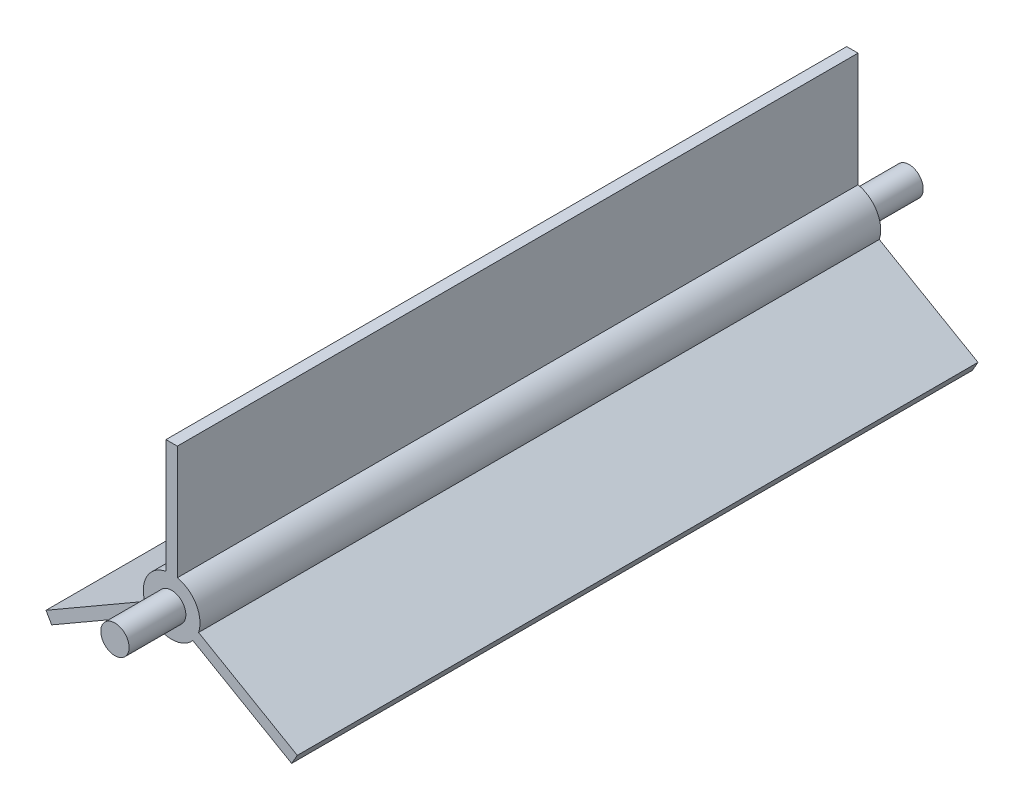
ISO-10303-21;
HEADER;
FILE_DESCRIPTION(('STEP AP214'),'2;1');
FILE_NAME('part.step','',(''),(''),'','','');
FILE_SCHEMA(('AUTOMOTIVE_DESIGN { 1 0 10303 214 1 1 1 1 }'));
ENDSEC;
DATA;
#1=APPLICATION_CONTEXT('core data for automotive mechanical design processes');
#2=APPLICATION_PROTOCOL_DEFINITION('international standard','automotive_design',2000,#1);
#3=PRODUCT_CONTEXT('',#1,'mechanical');
#4=PRODUCT('Part','Part','',(#3));
#5=PRODUCT_RELATED_PRODUCT_CATEGORY('part','',(#4));
#6=PRODUCT_DEFINITION_FORMATION('','',#4);
#7=PRODUCT_DEFINITION_CONTEXT('part definition',#1,'design');
#8=PRODUCT_DEFINITION('design','',#6,#7);
#9=PRODUCT_DEFINITION_SHAPE('','',#8);
#10=(LENGTH_UNIT() NAMED_UNIT(*) SI_UNIT(.MILLI.,.METRE.));
#11=(NAMED_UNIT(*) PLANE_ANGLE_UNIT() SI_UNIT($,.RADIAN.));
#12=(NAMED_UNIT(*) SI_UNIT($,.STERADIAN.) SOLID_ANGLE_UNIT());
#13=UNCERTAINTY_MEASURE_WITH_UNIT(LENGTH_MEASURE(1.E-05),#10,'distance_accuracy_value','');
#14=(GEOMETRIC_REPRESENTATION_CONTEXT(3) GLOBAL_UNCERTAINTY_ASSIGNED_CONTEXT((#13)) GLOBAL_UNIT_ASSIGNED_CONTEXT((#10,
#11,#12)) REPRESENTATION_CONTEXT('',''));
#15=CARTESIAN_POINT('',(0.,0.,0.));
#16=DIRECTION('',(0.,0.,1.));
#17=DIRECTION('',(1.,0.,0.));
#18=AXIS2_PLACEMENT_3D('',#15,#16,#17);
#19=CARTESIAN_POINT('',(-1.27000000000001,2.19970452561247,304.8));
#20=DIRECTION('',(0.500000000000004,-0.866025403784436,0.));
#21=DIRECTION('',(0.866025403784436,0.500000000000004,0.));
#22=AXIS2_PLACEMENT_3D('',#19,#20,#21);
#23=PLANE('',#22);
#24=DIRECTION('',(-0.866025403784436,-0.500000000000004,0.));
#25=VECTOR('',#24,1.);
#26=CARTESIAN_POINT('',(-1.27000000000001,2.19970452561247,0.));
#27=LINE('',#26,#25);
#28=CARTESIAN_POINT('',(-12.046307345283,-4.02199942105686,0.));
#29=VERTEX_POINT('',#28);
#30=CARTESIAN_POINT('',(-56.2626131403117,-29.5502954743878,0.));
#31=VERTEX_POINT('',#30);
#32=EDGE_CURVE('E167',#29,#31,#27,.T.);
#33=ORIENTED_EDGE('',*,*,#32,.T.);
#34=DIRECTION('',(0.,0.,-1.));
#35=VECTOR('',#34,1.);
#36=CARTESIAN_POINT('',(-56.2626131403117,-29.5502954743878,304.8));
#37=LINE('',#36,#35);
#38=CARTESIAN_POINT('',(-56.2626131403117,-29.5502954743878,304.8));
#39=VERTEX_POINT('',#38);
#40=EDGE_CURVE('E51',#39,#31,#37,.T.);
#41=ORIENTED_EDGE('',*,*,#40,.F.);
#42=DIRECTION('',(-0.866025403784436,-0.500000000000004,0.));
#43=VECTOR('',#42,1.);
#44=CARTESIAN_POINT('',(-1.27000000000001,2.19970452561247,304.8));
#45=LINE('',#44,#43);
#46=CARTESIAN_POINT('',(-12.046307345283,-4.02199942105686,304.8));
#47=VERTEX_POINT('',#46);
#48=EDGE_CURVE('E208',#47,#39,#45,.T.);
#49=ORIENTED_EDGE('',*,*,#48,.F.);
#50=DIRECTION('',(0.,0.,-1.));
#51=VECTOR('',#50,1.);
#52=CARTESIAN_POINT('',(-12.046307345283,-4.02199942105686,304.8));
#53=LINE('',#52,#51);
#54=EDGE_CURVE('E163',#47,#29,#53,.T.);
#55=ORIENTED_EDGE('',*,*,#54,.T.);
#56=EDGE_LOOP('',(#33,#41,#49,#55));
#57=FACE_BOUND('',#56,.T.);
#58=ADVANCED_FACE('F41',(#57),#23,.F.);
#59=CARTESIAN_POINT('',(-54.9926131403117,-31.7500000000003,304.8));
#60=DIRECTION('',(0.866025403784436,0.500000000000005,0.));
#61=DIRECTION('',(-0.500000000000005,0.866025403784436,0.));
#62=AXIS2_PLACEMENT_3D('',#59,#60,#61);
#63=PLANE('',#62);
#64=DIRECTION('',(0.500000000000005,-0.866025403784436,0.));
#65=VECTOR('',#64,1.);
#66=CARTESIAN_POINT('',(-54.9926131403117,-31.7500000000003,0.));
#67=LINE('',#66,#65);
#68=CARTESIAN_POINT('',(-53.7226131403117,-33.9497045256128,0.));
#69=VERTEX_POINT('',#68);
#70=EDGE_CURVE('E171',#31,#69,#67,.T.);
#71=ORIENTED_EDGE('',*,*,#70,.T.);
#72=DIRECTION('',(0.,0.,-1.));
#73=VECTOR('',#72,1.);
#74=CARTESIAN_POINT('',(-53.7226131403117,-33.9497045256128,304.8));
#75=LINE('',#74,#73);
#76=CARTESIAN_POINT('',(-53.7226131403117,-33.9497045256128,304.8));
#77=VERTEX_POINT('',#76);
#78=EDGE_CURVE('E235',#77,#69,#75,.T.);
#79=ORIENTED_EDGE('',*,*,#78,.F.);
#80=DIRECTION('',(0.500000000000005,-0.866025403784436,0.));
#81=VECTOR('',#80,1.);
#82=CARTESIAN_POINT('',(-54.9926131403117,-31.7500000000003,304.8));
#83=LINE('',#82,#81);
#84=EDGE_CURVE('E112',#39,#77,#83,.T.);
#85=ORIENTED_EDGE('',*,*,#84,.F.);
#86=ORIENTED_EDGE('',*,*,#40,.T.);
#87=EDGE_LOOP('',(#71,#79,#85,#86));
#88=FACE_BOUND('',#87,.T.);
#89=ADVANCED_FACE('F239',(#88),#63,.F.);
#90=CARTESIAN_POINT('',(1.27000000000001,-2.19970452561247,304.8));
#91=DIRECTION('',(0.500000000000004,-0.866025403784436,0.));
#92=DIRECTION('',(0.866025403784436,0.500000000000005,0.));
#93=AXIS2_PLACEMENT_3D('',#90,#91,#92);
#94=PLANE('',#93);
#95=DIRECTION('',(-0.866025403784436,-0.500000000000004,0.));
#96=VECTOR('',#95,1.);
#97=CARTESIAN_POINT('',(1.27000000000001,-2.19970452561247,0.));
#98=LINE('',#97,#96);
#99=CARTESIAN_POINT('',(-9.50630734528294,-8.4214084722818,0.));
#100=VERTEX_POINT('',#99);
#101=EDGE_CURVE('E175',#100,#69,#98,.T.);
#102=ORIENTED_EDGE('',*,*,#101,.F.);
#103=DIRECTION('',(0.,0.,-1.));
#104=VECTOR('',#103,1.);
#105=CARTESIAN_POINT('',(-9.50630734528294,-8.4214084722818,304.8));
#106=LINE('',#105,#104);
#107=CARTESIAN_POINT('',(-9.50630734528294,-8.4214084722818,304.8));
#108=VERTEX_POINT('',#107);
#109=EDGE_CURVE('E232',#108,#100,#106,.T.);
#110=ORIENTED_EDGE('',*,*,#109,.F.);
#111=DIRECTION('',(-0.866025403784436,-0.500000000000004,0.));
#112=VECTOR('',#111,1.);
#113=CARTESIAN_POINT('',(1.27000000000001,-2.19970452561247,304.8));
#114=LINE('',#113,#112);
#115=EDGE_CURVE('E253',#108,#77,#114,.T.);
#116=ORIENTED_EDGE('',*,*,#115,.T.);
#117=ORIENTED_EDGE('',*,*,#78,.T.);
#118=EDGE_LOOP('',(#102,#110,#116,#117));
#119=FACE_BOUND('',#118,.T.);
#120=ADVANCED_FACE('F249',(#119),#94,.T.);
#121=CARTESIAN_POINT('',(0.,0.,304.8));
#122=DIRECTION('',(0.,0.,-1.));
#123=DIRECTION('',(-1.,0.,0.));
#124=AXIS2_PLACEMENT_3D('',#121,#122,#123);
#125=CYLINDRICAL_SURFACE('',#124,12.7);
#126=CARTESIAN_POINT('',(0.,0.,0.));
#127=DIRECTION('',(0.,0.,1.));
#128=DIRECTION('',(1.,0.,0.));
#129=AXIS2_PLACEMENT_3D('',#126,#127,#128);
#130=CIRCLE('',#129,12.7);
#131=CARTESIAN_POINT('',(9.50630734528294,-8.42140847228179,0.));
#132=VERTEX_POINT('',#131);
#133=EDGE_CURVE('E179',#100,#132,#130,.T.);
#134=ORIENTED_EDGE('',*,*,#133,.T.);
#135=DIRECTION('',(0.,0.,-1.));
#136=VECTOR('',#135,1.);
#137=CARTESIAN_POINT('',(9.50630734528294,-8.42140847228179,304.8));
#138=LINE('',#137,#136);
#139=CARTESIAN_POINT('',(9.50630734528294,-8.42140847228179,304.8));
#140=VERTEX_POINT('',#139);
#141=EDGE_CURVE('E228',#140,#132,#138,.T.);
#142=ORIENTED_EDGE('',*,*,#141,.F.);
#143=CARTESIAN_POINT('',(0.,0.,304.8));
#144=DIRECTION('',(0.,0.,1.));
#145=DIRECTION('',(1.,0.,0.));
#146=AXIS2_PLACEMENT_3D('',#143,#144,#145);
#147=CIRCLE('',#146,12.7);
#148=EDGE_CURVE('E255',#108,#140,#147,.T.);
#149=ORIENTED_EDGE('',*,*,#148,.F.);
#150=ORIENTED_EDGE('',*,*,#109,.T.);
#151=EDGE_LOOP('',(#134,#142,#149,#150));
#152=FACE_BOUND('',#151,.T.);
#153=ADVANCED_FACE('F299',(#152),#125,.T.);
#154=CARTESIAN_POINT('',(-1.27000000000001,-2.19970452561247,304.8));
#155=DIRECTION('',(0.500000000000004,0.866025403784436,0.));
#156=DIRECTION('',(-0.866025403784436,0.500000000000004,0.));
#157=AXIS2_PLACEMENT_3D('',#154,#155,#156);
#158=PLANE('',#157);
#159=DIRECTION('',(0.866025403784436,-0.500000000000004,0.));
#160=VECTOR('',#159,1.);
#161=CARTESIAN_POINT('',(-1.27000000000001,-2.19970452561247,0.));
#162=LINE('',#161,#160);
#163=CARTESIAN_POINT('',(53.7226131403117,-33.9497045256127,0.));
#164=VERTEX_POINT('',#163);
#165=EDGE_CURVE('E182',#132,#164,#162,.T.);
#166=ORIENTED_EDGE('',*,*,#165,.T.);
#167=DIRECTION('',(0.,0.,-1.));
#168=VECTOR('',#167,1.);
#169=CARTESIAN_POINT('',(53.7226131403117,-33.9497045256127,304.8));
#170=LINE('',#169,#168);
#171=CARTESIAN_POINT('',(53.7226131403117,-33.9497045256127,304.8));
#172=VERTEX_POINT('',#171);
#173=EDGE_CURVE('E225',#172,#164,#170,.T.);
#174=ORIENTED_EDGE('',*,*,#173,.F.);
#175=DIRECTION('',(0.866025403784436,-0.500000000000004,0.));
#176=VECTOR('',#175,1.);
#177=CARTESIAN_POINT('',(-1.27000000000001,-2.19970452561247,304.8));
#178=LINE('',#177,#176);
#179=EDGE_CURVE('E259',#140,#172,#178,.T.);
#180=ORIENTED_EDGE('',*,*,#179,.F.);
#181=ORIENTED_EDGE('',*,*,#141,.T.);
#182=EDGE_LOOP('',(#166,#174,#180,#181));
#183=FACE_BOUND('',#182,.T.);
#184=ADVANCED_FACE('F295',(#183),#158,.F.);
#185=CARTESIAN_POINT('',(54.9926131403118,-31.7500000000002,304.8));
#186=DIRECTION('',(0.866025403784437,-0.500000000000003,0.));
#187=DIRECTION('',(0.500000000000003,0.866025403784437,0.));
#188=AXIS2_PLACEMENT_3D('',#185,#186,#187);
#189=PLANE('',#188);
#190=DIRECTION('',(-0.500000000000003,-0.866025403784437,0.));
#191=VECTOR('',#190,1.);
#192=CARTESIAN_POINT('',(54.9926131403118,-31.7500000000002,0.));
#193=LINE('',#192,#191);
#194=CARTESIAN_POINT('',(56.2626131403117,-29.5502954743878,0.));
#195=VERTEX_POINT('',#194);
#196=EDGE_CURVE('E186',#195,#164,#193,.T.);
#197=ORIENTED_EDGE('',*,*,#196,.F.);
#198=DIRECTION('',(0.,0.,-1.));
#199=VECTOR('',#198,1.);
#200=CARTESIAN_POINT('',(56.2626131403117,-29.5502954743878,304.8));
#201=LINE('',#200,#199);
#202=CARTESIAN_POINT('',(56.2626131403117,-29.5502954743878,304.8));
#203=VERTEX_POINT('',#202);
#204=EDGE_CURVE('E222',#203,#195,#201,.T.);
#205=ORIENTED_EDGE('',*,*,#204,.F.);
#206=DIRECTION('',(-0.500000000000003,-0.866025403784437,0.));
#207=VECTOR('',#206,1.);
#208=CARTESIAN_POINT('',(54.9926131403118,-31.7500000000002,304.8));
#209=LINE('',#208,#207);
#210=EDGE_CURVE('E266',#203,#172,#209,.T.);
#211=ORIENTED_EDGE('',*,*,#210,.T.);
#212=ORIENTED_EDGE('',*,*,#173,.T.);
#213=EDGE_LOOP('',(#197,#205,#211,#212));
#214=FACE_BOUND('',#213,.T.);
#215=ADVANCED_FACE('F292',(#214),#189,.T.);
#216=CARTESIAN_POINT('',(1.27000000000001,2.19970452561247,304.8));
#217=DIRECTION('',(0.500000000000004,0.866025403784436,0.));
#218=DIRECTION('',(-0.866025403784436,0.500000000000004,0.));
#219=AXIS2_PLACEMENT_3D('',#216,#217,#218);
#220=PLANE('',#219);
#221=DIRECTION('',(0.866025403784436,-0.500000000000004,0.));
#222=VECTOR('',#221,1.);
#223=CARTESIAN_POINT('',(1.27000000000001,2.19970452561247,0.));
#224=LINE('',#223,#222);
#225=CARTESIAN_POINT('',(12.046307345283,-4.02199942105685,0.));
#226=VERTEX_POINT('',#225);
#227=EDGE_CURVE('E190',#226,#195,#224,.T.);
#228=ORIENTED_EDGE('',*,*,#227,.F.);
#229=DIRECTION('',(0.,0.,-1.));
#230=VECTOR('',#229,1.);
#231=CARTESIAN_POINT('',(12.046307345283,-4.02199942105685,304.8));
#232=LINE('',#231,#230);
#233=CARTESIAN_POINT('',(12.046307345283,-4.02199942105685,304.8));
#234=VERTEX_POINT('',#233);
#235=EDGE_CURVE('E219',#234,#226,#232,.T.);
#236=ORIENTED_EDGE('',*,*,#235,.F.);
#237=DIRECTION('',(0.866025403784436,-0.500000000000004,0.));
#238=VECTOR('',#237,1.);
#239=CARTESIAN_POINT('',(1.27000000000001,2.19970452561247,304.8));
#240=LINE('',#239,#238);
#241=EDGE_CURVE('E270',#234,#203,#240,.T.);
#242=ORIENTED_EDGE('',*,*,#241,.T.);
#243=ORIENTED_EDGE('',*,*,#204,.T.);
#244=EDGE_LOOP('',(#228,#236,#242,#243));
#245=FACE_BOUND('',#244,.T.);
#246=ADVANCED_FACE('F289',(#245),#220,.T.);
#247=CARTESIAN_POINT('',(0.,0.,304.8));
#248=DIRECTION('',(0.,0.,-1.));
#249=DIRECTION('',(-1.,0.,0.));
#250=AXIS2_PLACEMENT_3D('',#247,#248,#249);
#251=CYLINDRICAL_SURFACE('',#250,12.7);
#252=CARTESIAN_POINT('',(0.,0.,0.));
#253=DIRECTION('',(0.,0.,1.));
#254=DIRECTION('',(1.,0.,0.));
#255=AXIS2_PLACEMENT_3D('',#252,#253,#254);
#256=CIRCLE('',#255,12.7);
#257=CARTESIAN_POINT('',(2.54,12.4434078933385,0.));
#258=VERTEX_POINT('',#257);
#259=EDGE_CURVE('E194',#226,#258,#256,.T.);
#260=ORIENTED_EDGE('',*,*,#259,.T.);
#261=DIRECTION('',(0.,0.,-1.));
#262=VECTOR('',#261,1.);
#263=CARTESIAN_POINT('',(2.54,12.4434078933385,304.8));
#264=LINE('',#263,#262);
#265=CARTESIAN_POINT('',(2.54,12.4434078933385,304.8));
#266=VERTEX_POINT('',#265);
#267=EDGE_CURVE('E215',#266,#258,#264,.T.);
#268=ORIENTED_EDGE('',*,*,#267,.F.);
#269=CARTESIAN_POINT('',(0.,0.,304.8));
#270=DIRECTION('',(0.,0.,1.));
#271=DIRECTION('',(1.,0.,0.));
#272=AXIS2_PLACEMENT_3D('',#269,#270,#271);
#273=CIRCLE('',#272,12.7);
#274=EDGE_CURVE('E274',#234,#266,#273,.T.);
#275=ORIENTED_EDGE('',*,*,#274,.F.);
#276=ORIENTED_EDGE('',*,*,#235,.T.);
#277=EDGE_LOOP('',(#260,#268,#275,#276));
#278=FACE_BOUND('',#277,.T.);
#279=ADVANCED_FACE('F282',(#278),#251,.T.);
#280=CARTESIAN_POINT('',(2.54,0.,304.8));
#281=DIRECTION('',(-1.,0.,0.));
#282=DIRECTION('',(0.,-1.,0.));
#283=AXIS2_PLACEMENT_3D('',#280,#281,#282);
#284=PLANE('',#283);
#285=DIRECTION('',(0.,1.,0.));
#286=VECTOR('',#285,1.);
#287=CARTESIAN_POINT('',(2.54,0.,0.));
#288=LINE('',#287,#286);
#289=CARTESIAN_POINT('',(2.54,63.5,0.));
#290=VERTEX_POINT('',#289);
#291=EDGE_CURVE('E197',#258,#290,#288,.T.);
#292=ORIENTED_EDGE('',*,*,#291,.T.);
#293=DIRECTION('',(0.,0.,-1.));
#294=VECTOR('',#293,1.);
#295=CARTESIAN_POINT('',(2.54,63.5,304.8));
#296=LINE('',#295,#294);
#297=CARTESIAN_POINT('',(2.54,63.5,304.8));
#298=VERTEX_POINT('',#297);
#299=EDGE_CURVE('E150',#298,#290,#296,.T.);
#300=ORIENTED_EDGE('',*,*,#299,.F.);
#301=DIRECTION('',(0.,1.,0.));
#302=VECTOR('',#301,1.);
#303=CARTESIAN_POINT('',(2.54,0.,304.8));
#304=LINE('',#303,#302);
#305=EDGE_CURVE('E155',#266,#298,#304,.T.);
#306=ORIENTED_EDGE('',*,*,#305,.F.);
#307=ORIENTED_EDGE('',*,*,#267,.T.);
#308=EDGE_LOOP('',(#292,#300,#306,#307));
#309=FACE_BOUND('',#308,.T.);
#310=ADVANCED_FACE('F286',(#309),#284,.F.);
#311=CARTESIAN_POINT('',(0.,63.5,304.8));
#312=DIRECTION('',(0.,1.,0.));
#313=DIRECTION('',(0.,0.,1.));
#314=AXIS2_PLACEMENT_3D('',#311,#312,#313);
#315=PLANE('',#314);
#316=DIRECTION('',(1.,0.,0.));
#317=VECTOR('',#316,1.);
#318=CARTESIAN_POINT('',(0.,63.5,0.));
#319=LINE('',#318,#317);
#320=CARTESIAN_POINT('',(-2.54,63.5,0.));
#321=VERTEX_POINT('',#320);
#322=EDGE_CURVE('E144',#321,#290,#319,.T.);
#323=ORIENTED_EDGE('',*,*,#322,.F.);
#324=DIRECTION('',(0.,0.,-1.));
#325=VECTOR('',#324,1.);
#326=CARTESIAN_POINT('',(-2.54,63.5,304.8));
#327=LINE('',#326,#325);
#328=CARTESIAN_POINT('',(-2.54,63.5,304.8));
#329=VERTEX_POINT('',#328);
#330=EDGE_CURVE('E139',#329,#321,#327,.T.);
#331=ORIENTED_EDGE('',*,*,#330,.F.);
#332=DIRECTION('',(1.,0.,0.));
#333=VECTOR('',#332,1.);
#334=CARTESIAN_POINT('',(0.,63.5,304.8));
#335=LINE('',#334,#333);
#336=EDGE_CURVE('E142',#329,#298,#335,.T.);
#337=ORIENTED_EDGE('',*,*,#336,.T.);
#338=ORIENTED_EDGE('',*,*,#299,.T.);
#339=EDGE_LOOP('',(#323,#331,#337,#338));
#340=FACE_BOUND('',#339,.T.);
#341=ADVANCED_FACE('F141',(#340),#315,.T.);
#342=CARTESIAN_POINT('',(-2.54,0.,304.8));
#343=DIRECTION('',(-1.,0.,0.));
#344=DIRECTION('',(0.,0.,1.));
#345=AXIS2_PLACEMENT_3D('',#342,#343,#344);
#346=PLANE('',#345);
#347=DIRECTION('',(0.,1.,0.));
#348=VECTOR('',#347,1.);
#349=CARTESIAN_POINT('',(-2.54,0.,0.));
#350=LINE('',#349,#348);
#351=CARTESIAN_POINT('',(-2.54,12.4434078933385,0.));
#352=VERTEX_POINT('',#351);
#353=EDGE_CURVE('E203',#352,#321,#350,.T.);
#354=ORIENTED_EDGE('',*,*,#353,.F.);
#355=DIRECTION('',(0.,0.,-1.));
#356=VECTOR('',#355,1.);
#357=CARTESIAN_POINT('',(-2.54,12.4434078933385,304.8));
#358=LINE('',#357,#356);
#359=CARTESIAN_POINT('',(-2.54,12.4434078933385,304.8));
#360=VERTEX_POINT('',#359);
#361=EDGE_CURVE('E100',#360,#352,#358,.T.);
#362=ORIENTED_EDGE('',*,*,#361,.F.);
#363=DIRECTION('',(0.,1.,0.));
#364=VECTOR('',#363,1.);
#365=CARTESIAN_POINT('',(-2.54,0.,304.8));
#366=LINE('',#365,#364);
#367=EDGE_CURVE('E153',#360,#329,#366,.T.);
#368=ORIENTED_EDGE('',*,*,#367,.T.);
#369=ORIENTED_EDGE('',*,*,#330,.T.);
#370=EDGE_LOOP('',(#354,#362,#368,#369));
#371=FACE_BOUND('',#370,.T.);
#372=ADVANCED_FACE('F159',(#371),#346,.T.);
#373=CARTESIAN_POINT('',(0.,0.,304.8));
#374=DIRECTION('',(0.,0.,-1.));
#375=DIRECTION('',(-1.,0.,0.));
#376=AXIS2_PLACEMENT_3D('',#373,#374,#375);
#377=CYLINDRICAL_SURFACE('',#376,12.7);
#378=CARTESIAN_POINT('',(0.,0.,0.));
#379=DIRECTION('',(0.,0.,1.));
#380=DIRECTION('',(1.,0.,0.));
#381=AXIS2_PLACEMENT_3D('',#378,#379,#380);
#382=CIRCLE('',#381,12.7);
#383=EDGE_CURVE('E103',#352,#29,#382,.T.);
#384=ORIENTED_EDGE('',*,*,#383,.T.);
#385=ORIENTED_EDGE('',*,*,#54,.F.);
#386=CARTESIAN_POINT('',(0.,0.,304.8));
#387=DIRECTION('',(0.,0.,1.));
#388=DIRECTION('',(1.,0.,0.));
#389=AXIS2_PLACEMENT_3D('',#386,#387,#388);
#390=CIRCLE('',#389,12.7);
#391=EDGE_CURVE('E60',#360,#47,#390,.T.);
#392=ORIENTED_EDGE('',*,*,#391,.F.);
#393=ORIENTED_EDGE('',*,*,#361,.T.);
#394=EDGE_LOOP('',(#384,#385,#392,#393));
#395=FACE_BOUND('',#394,.T.);
#396=ADVANCED_FACE('F377',(#395),#377,.T.);
#397=CARTESIAN_POINT('',(0.,0.,304.8));
#398=DIRECTION('',(0.,0.,1.));
#399=DIRECTION('',(1.,0.,0.));
#400=AXIS2_PLACEMENT_3D('',#397,#398,#399);
#401=PLANE('',#400);
#402=CARTESIAN_POINT('',(0.,0.,304.8));
#403=DIRECTION('',(0.,0.,1.));
#404=DIRECTION('',(1.,0.,0.));
#405=AXIS2_PLACEMENT_3D('',#402,#403,#404);
#406=CIRCLE('',#405,6.35);
#407=CARTESIAN_POINT('',(6.35,0.,304.8));
#408=VERTEX_POINT('',#407);
#409=EDGE_CURVE('E11',#408,#408,#406,.T.);
#410=ORIENTED_EDGE('',*,*,#409,.F.);
#411=EDGE_LOOP('',(#410));
#412=FACE_BOUND('',#411,.T.);
#413=ORIENTED_EDGE('',*,*,#48,.T.);
#414=ORIENTED_EDGE('',*,*,#84,.T.);
#415=ORIENTED_EDGE('',*,*,#115,.F.);
#416=ORIENTED_EDGE('',*,*,#148,.T.);
#417=ORIENTED_EDGE('',*,*,#179,.T.);
#418=ORIENTED_EDGE('',*,*,#210,.F.);
#419=ORIENTED_EDGE('',*,*,#241,.F.);
#420=ORIENTED_EDGE('',*,*,#274,.T.);
#421=ORIENTED_EDGE('',*,*,#305,.T.);
#422=ORIENTED_EDGE('',*,*,#336,.F.);
#423=ORIENTED_EDGE('',*,*,#367,.F.);
#424=ORIENTED_EDGE('',*,*,#391,.T.);
#425=EDGE_LOOP('',(#413,#414,#415,#416,#417,#418,#419,#420,#421,#422,#423,#424));
#426=FACE_BOUND('',#425,.T.);
#427=ADVANCED_FACE('F152',(#412,#426),#401,.T.);
#428=CARTESIAN_POINT('',(0.,0.,0.));
#429=DIRECTION('',(0.,0.,1.));
#430=DIRECTION('',(1.,0.,0.));
#431=AXIS2_PLACEMENT_3D('',#428,#429,#430);
#432=PLANE('',#431);
#433=CARTESIAN_POINT('',(0.,0.,0.));
#434=DIRECTION('',(0.,0.,1.));
#435=DIRECTION('',(1.,0.,0.));
#436=AXIS2_PLACEMENT_3D('',#433,#434,#435);
#437=CIRCLE('',#436,6.35);
#438=CARTESIAN_POINT('',(6.35,0.,0.));
#439=VERTEX_POINT('',#438);
#440=EDGE_CURVE('E44',#439,#439,#437,.T.);
#441=ORIENTED_EDGE('',*,*,#440,.T.);
#442=EDGE_LOOP('',(#441));
#443=FACE_BOUND('',#442,.T.);
#444=ORIENTED_EDGE('',*,*,#32,.F.);
#445=ORIENTED_EDGE('',*,*,#383,.F.);
#446=ORIENTED_EDGE('',*,*,#353,.T.);
#447=ORIENTED_EDGE('',*,*,#322,.T.);
#448=ORIENTED_EDGE('',*,*,#291,.F.);
#449=ORIENTED_EDGE('',*,*,#259,.F.);
#450=ORIENTED_EDGE('',*,*,#227,.T.);
#451=ORIENTED_EDGE('',*,*,#196,.T.);
#452=ORIENTED_EDGE('',*,*,#165,.F.);
#453=ORIENTED_EDGE('',*,*,#133,.F.);
#454=ORIENTED_EDGE('',*,*,#101,.T.);
#455=ORIENTED_EDGE('',*,*,#70,.F.);
#456=EDGE_LOOP('',(#444,#445,#446,#447,#448,#449,#450,#451,#452,#453,#454,#455));
#457=FACE_BOUND('',#456,.T.);
#458=ADVANCED_FACE('F244',(#443,#457),#432,.F.);
#459=CARTESIAN_POINT('',(0.,0.,-25.4));
#460=DIRECTION('',(0.,0.,1.));
#461=DIRECTION('',(1.,0.,0.));
#462=AXIS2_PLACEMENT_3D('',#459,#460,#461);
#463=PLANE('',#462);
#464=CARTESIAN_POINT('',(0.,0.,-25.4));
#465=DIRECTION('',(0.,0.,1.));
#466=DIRECTION('',(1.,0.,0.));
#467=AXIS2_PLACEMENT_3D('',#464,#465,#466);
#468=CIRCLE('',#467,6.35);
#469=CARTESIAN_POINT('',(6.35,0.,-25.4));
#470=VERTEX_POINT('',#469);
#471=EDGE_CURVE('E455',#470,#470,#468,.T.);
#472=ORIENTED_EDGE('',*,*,#471,.F.);
#473=EDGE_LOOP('',(#472));
#474=FACE_BOUND('',#473,.T.);
#475=ADVANCED_FACE('F406',(#474),#463,.F.);
#476=CARTESIAN_POINT('',(0.,0.,-25.4));
#477=DIRECTION('',(0.,0.,1.));
#478=DIRECTION('',(1.,0.,0.));
#479=AXIS2_PLACEMENT_3D('',#476,#477,#478);
#480=CYLINDRICAL_SURFACE('',#479,6.35);
#481=ORIENTED_EDGE('',*,*,#471,.T.);
#482=EDGE_LOOP('',(#481));
#483=FACE_BOUND('',#482,.T.);
#484=ORIENTED_EDGE('',*,*,#440,.F.);
#485=EDGE_LOOP('',(#484));
#486=FACE_BOUND('',#485,.T.);
#487=ADVANCED_FACE('F417',(#483,#486),#480,.T.);
#488=ORIENTED_EDGE('',*,*,#409,.T.);
#489=EDGE_LOOP('',(#488));
#490=FACE_BOUND('',#489,.T.);
#491=CARTESIAN_POINT('',(0.,0.,330.2));
#492=DIRECTION('',(0.,0.,1.));
#493=DIRECTION('',(1.,0.,0.));
#494=AXIS2_PLACEMENT_3D('',#491,#492,#493);
#495=CIRCLE('',#494,6.35);
#496=CARTESIAN_POINT('',(6.35,0.,330.2));
#497=VERTEX_POINT('',#496);
#498=EDGE_CURVE('E452',#497,#497,#495,.T.);
#499=ORIENTED_EDGE('',*,*,#498,.F.);
#500=EDGE_LOOP('',(#499));
#501=FACE_BOUND('',#500,.T.);
#502=ADVANCED_FACE('F427',(#490,#501),#480,.T.);
#503=CARTESIAN_POINT('',(0.,0.,330.2));
#504=DIRECTION('',(0.,0.,1.));
#505=DIRECTION('',(1.,0.,0.));
#506=AXIS2_PLACEMENT_3D('',#503,#504,#505);
#507=PLANE('',#506);
#508=ORIENTED_EDGE('',*,*,#498,.T.);
#509=EDGE_LOOP('',(#508));
#510=FACE_BOUND('',#509,.T.);
#511=ADVANCED_FACE('F437',(#510),#507,.T.);
#512=CLOSED_SHELL('',(#58,#89,#120,#153,#184,#215,#246,#279,#310,#341,#372,#396,#427,#458,#475,
#487,#502,#511));
#513=MANIFOLD_SOLID_BREP('B2',#512);
#514=ADVANCED_BREP_SHAPE_REPRESENTATION('',(#18,#513),#14);
#515=SHAPE_DEFINITION_REPRESENTATION(#9,#514);
ENDSEC;
END-ISO-10303-21;
